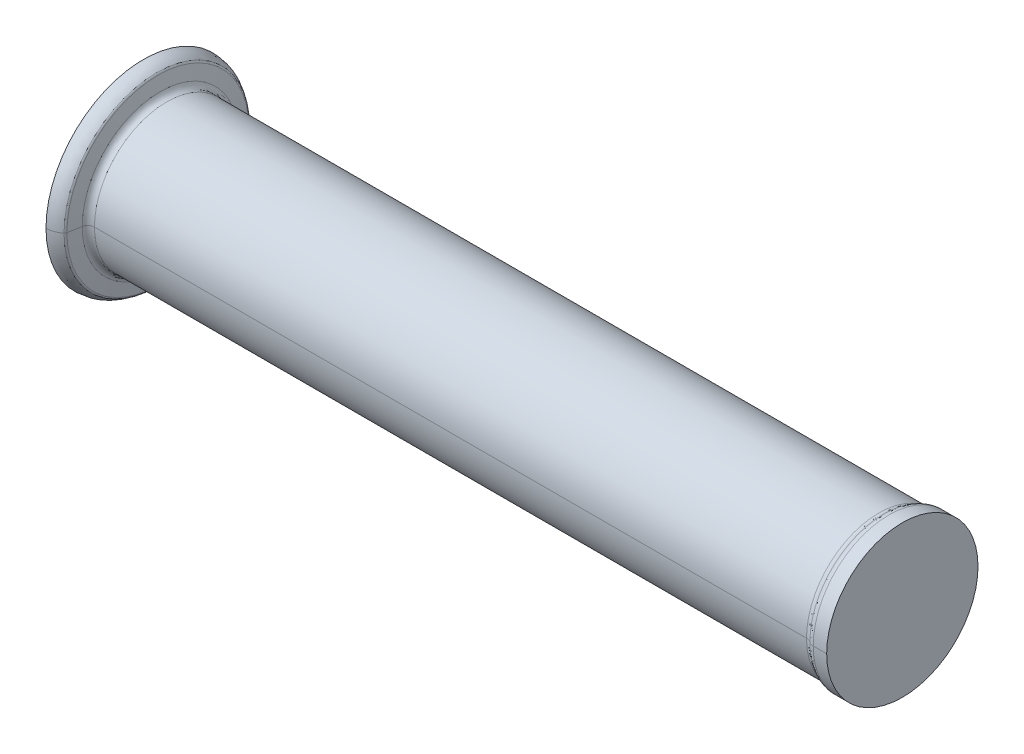
ISO-10303-21;
HEADER;
FILE_DESCRIPTION(('STEP AP214'),'2;1');
FILE_NAME('part.step','',(''),(''),'','','');
FILE_SCHEMA(('AUTOMOTIVE_DESIGN { 1 0 10303 214 1 1 1 1 }'));
ENDSEC;
DATA;
#1=APPLICATION_CONTEXT('core data for automotive mechanical design processes');
#2=APPLICATION_PROTOCOL_DEFINITION('international standard','automotive_design',2000,#1);
#3=PRODUCT_CONTEXT('',#1,'mechanical');
#4=PRODUCT('Part','Part','',(#3));
#5=PRODUCT_RELATED_PRODUCT_CATEGORY('part','',(#4));
#6=PRODUCT_DEFINITION_FORMATION('','',#4);
#7=PRODUCT_DEFINITION_CONTEXT('part definition',#1,'design');
#8=PRODUCT_DEFINITION('design','',#6,#7);
#9=PRODUCT_DEFINITION_SHAPE('','',#8);
#10=(LENGTH_UNIT() NAMED_UNIT(*) SI_UNIT(.MILLI.,.METRE.));
#11=(NAMED_UNIT(*) PLANE_ANGLE_UNIT() SI_UNIT($,.RADIAN.));
#12=(NAMED_UNIT(*) SI_UNIT($,.STERADIAN.) SOLID_ANGLE_UNIT());
#13=UNCERTAINTY_MEASURE_WITH_UNIT(LENGTH_MEASURE(1.E-05),#10,'distance_accuracy_value','');
#14=(GEOMETRIC_REPRESENTATION_CONTEXT(3) GLOBAL_UNCERTAINTY_ASSIGNED_CONTEXT((#13)) GLOBAL_UNIT_ASSIGNED_CONTEXT((#10,
#11,#12)) REPRESENTATION_CONTEXT('',''));
#15=CARTESIAN_POINT('',(0.,0.,0.));
#16=DIRECTION('',(0.,0.,1.));
#17=DIRECTION('',(1.,0.,0.));
#18=AXIS2_PLACEMENT_3D('',#15,#16,#17);
#19=CARTESIAN_POINT('',(-246.376197469678,22.236182274753,-4.27553941091218));
#20=DIRECTION('',(1.,0.,0.));
#21=DIRECTION('',(0.,0.,-1.));
#22=AXIS2_PLACEMENT_3D('',#19,#20,#21);
#23=CYLINDRICAL_SURFACE('',#22,43.);
#24=DIRECTION('',(1.,0.,0.));
#25=VECTOR('',#24,1.);
#26=CARTESIAN_POINT('',(-246.376197469678,22.236182274753,38.7244605890878));
#27=LINE('',#26,#25);
#28=CARTESIAN_POINT('',(-232.574031512422,22.236182274753,38.7244605890878));
#29=VERTEX_POINT('',#28);
#30=CARTESIAN_POINT('',(190.923802530321,22.236182274753,38.7244605890878));
#31=VERTEX_POINT('',#30);
#32=EDGE_CURVE('E114',#29,#31,#27,.T.);
#33=ORIENTED_EDGE('',*,*,#32,.F.);
#34=CARTESIAN_POINT('',(-232.574031512422,22.236182274753,-4.27553941091218));
#35=DIRECTION('',(1.,0.,0.));
#36=DIRECTION('',(0.,0.,-1.));
#37=AXIS2_PLACEMENT_3D('',#34,#35,#36);
#38=CIRCLE('',#37,43.);
#39=CARTESIAN_POINT('',(-232.574031512422,22.236182274753,-47.2755394109122));
#40=VERTEX_POINT('',#39);
#41=EDGE_CURVE('E21',#29,#40,#38,.T.);
#42=ORIENTED_EDGE('',*,*,#41,.T.);
#43=DIRECTION('',(1.,0.,0.));
#44=VECTOR('',#43,1.);
#45=CARTESIAN_POINT('',(-246.376197469678,22.236182274753,-47.2755394109122));
#46=LINE('',#45,#44);
#47=CARTESIAN_POINT('',(190.923802530321,22.236182274753,-47.2755394109122));
#48=VERTEX_POINT('',#47);
#49=EDGE_CURVE('E117',#40,#48,#46,.T.);
#50=ORIENTED_EDGE('',*,*,#49,.T.);
#51=CARTESIAN_POINT('',(190.923802530321,22.236182274753,-4.27553941091218));
#52=DIRECTION('',(-1.,0.,0.));
#53=DIRECTION('',(0.,0.,-1.));
#54=AXIS2_PLACEMENT_3D('',#51,#52,#53);
#55=CIRCLE('',#54,43.);
#56=EDGE_CURVE('E11',#48,#31,#55,.T.);
#57=ORIENTED_EDGE('',*,*,#56,.T.);
#58=EDGE_LOOP('',(#33,#42,#50,#57));
#59=FACE_BOUND('',#58,.T.);
#60=ADVANCED_FACE('F18',(#59),#23,.T.);
#61=CARTESIAN_POINT('',(190.923802530321,22.236182274753,38.7244605867936));
#62=CARTESIAN_POINT('',(190.923802530322,-63.7638177206586,38.7244605867936));
#63=CARTESIAN_POINT('',(190.923802530322,-63.7638177206587,-47.275539408618));
#64=CARTESIAN_POINT('',(190.923802530321,22.236182274753,-47.275539408618));
#65=CARTESIAN_POINT('',(192.015234199988,22.236182274753,38.7244605867937));
#66=CARTESIAN_POINT('',(192.015234199988,-63.7638177206587,38.7244605867936));
#67=CARTESIAN_POINT('',(192.015234199988,-63.7638177206587,-47.2755394086179));
#68=CARTESIAN_POINT('',(192.015234199988,22.236182274753,-47.2755394086181));
#69=CARTESIAN_POINT('',(193.050657195965,22.236182274753,39.0696015854524));
#70=CARTESIAN_POINT('',(193.050657195965,-64.454099717976,39.0696015854524));
#71=CARTESIAN_POINT('',(193.050657195965,-64.4540997179762,-47.6206804072767));
#72=CARTESIAN_POINT('',(193.050657195965,22.236182274753,-47.6206804072767));
#73=CARTESIAN_POINT('',(193.923802531698,22.236182274753,39.7244605872525));
#74=CARTESIAN_POINT('',(193.923802531698,-65.7638177215762,39.7244605872525));
#75=CARTESIAN_POINT('',(193.923802531698,-65.7638177215762,-48.2755394090767));
#76=CARTESIAN_POINT('',(193.923802531698,22.236182274753,-48.2755394090768));
#77=(BOUNDED_SURFACE() B_SPLINE_SURFACE(3,3,((#61,#62,#63,#64),(#65,#66,#67,#68),(#69,#70,#71,
#72),(#73,#74,#75,#76)),.UNSPECIFIED.,.F.,.F.,.F.) B_SPLINE_SURFACE_WITH_KNOTS((4,4),(4,4),(0.,
1.),(0.,1.),.UNSPECIFIED.) GEOMETRIC_REPRESENTATION_ITEM() RATIONAL_B_SPLINE_SURFACE(((1.,
0.333333333333334,0.333333333333334,1.),(0.96578886536701,0.321929621789003,0.321929621789003,
0.96578886536701),(0.96578886536701,0.321929621789003,0.321929621789003,0.96578886536701),(1.,
0.333333333333334,0.333333333333334,1.))) REPRESENTATION_ITEM('') SURFACE());
#78=CARTESIAN_POINT('',(190.923802530321,22.236182274753,43.7244605890878));
#79=DIRECTION('',(0.,-1.,0.));
#80=DIRECTION('',(0.,0.,1.));
#81=AXIS2_PLACEMENT_3D('',#78,#79,#80);
#82=CIRCLE('',#81,5.00000000229417);
#83=CARTESIAN_POINT('',(193.923802531698,22.236182274753,39.7244605872525));
#84=VERTEX_POINT('',#83);
#85=EDGE_CURVE('E134',#31,#84,#82,.T.);
#86=CARTESIAN_POINT('',(190.923802530321,22.236182274753,-52.2755394109122));
#87=DIRECTION('',(0.,1.,0.));
#88=DIRECTION('',(0.,0.,-1.));
#89=AXIS2_PLACEMENT_3D('',#86,#87,#88);
#90=CIRCLE('',#89,5.00000000229417);
#91=CARTESIAN_POINT('',(193.923802531698,22.236182274753,-48.2755394090768));
#92=VERTEX_POINT('',#91);
#93=EDGE_CURVE('E145',#48,#92,#90,.T.);
#94=CARTESIAN_POINT('',(193.923802531698,22.236182274753,-4.27553941091218));
#95=DIRECTION('',(1.,0.,0.));
#96=DIRECTION('',(0.,0.,-1.));
#97=AXIS2_PLACEMENT_3D('',#94,#95,#96);
#98=CIRCLE('',#97,43.9999999981647);
#99=EDGE_CURVE('E137',#84,#92,#98,.T.);
#100=ORIENTED_EDGE('',*,*,#85,.F.);
#101=ORIENTED_EDGE('',*,*,#56,.F.);
#102=ORIENTED_EDGE('',*,*,#93,.T.);
#103=ORIENTED_EDGE('',*,*,#99,.F.);
#104=EDGE_LOOP('',(#100,#101,#102,#103));
#105=FACE_BOUND('',#104,.T.);
#106=ADVANCED_FACE('F135',(#105),#77,.F.);
#107=CARTESIAN_POINT('',(-236.51326252447,22.236182274753,42.0298678784201));
#108=CARTESIAN_POINT('',(-236.513262524471,-70.3746323039115,42.02986787842));
#109=CARTESIAN_POINT('',(-236.513262524471,-70.3746323039116,-50.5809467002444));
#110=CARTESIAN_POINT('',(-236.51326252447,22.236182274753,-50.5809467002445));
#111=CARTESIAN_POINT('',(-236.160608563054,22.236182274753,40.0298678784201));
#112=CARTESIAN_POINT('',(-236.160608563054,-66.3746323039116,40.02986787842));
#113=CARTESIAN_POINT('',(-236.160608563054,-66.3746323039116,-48.5809467002444));
#114=CARTESIAN_POINT('',(-236.160608563054,22.236182274753,-48.5809467002444));
#115=CARTESIAN_POINT('',(-234.604884736193,22.236182274753,38.7244605890878));
#116=CARTESIAN_POINT('',(-234.604884736193,-63.763817725247,38.7244605890877));
#117=CARTESIAN_POINT('',(-234.604884736193,-63.763817725247,-47.2755394109122));
#118=CARTESIAN_POINT('',(-234.604884736193,22.236182274753,-47.2755394109122));
#119=CARTESIAN_POINT('',(-232.574031512422,22.236182274753,38.7244605890878));
#120=CARTESIAN_POINT('',(-232.574031512422,-63.7638177252469,38.7244605890878));
#121=CARTESIAN_POINT('',(-232.574031512422,-63.7638177252471,-47.2755394109122));
#122=CARTESIAN_POINT('',(-232.574031512422,22.236182274753,-47.2755394109122));
#123=(BOUNDED_SURFACE() B_SPLINE_SURFACE(3,3,((#107,#108,#109,#110),(#111,#112,#113,#114),(#115,
#116,#117,#118),(#119,#120,#121,#122)),.UNSPECIFIED.,.F.,.F.,
.F.) B_SPLINE_SURFACE_WITH_KNOTS((4,4),(4,4),(0.,1.),(0.,1.),
.UNSPECIFIED.) GEOMETRIC_REPRESENTATION_ITEM() RATIONAL_B_SPLINE_SURFACE(((1.,0.333333333333334,
0.333333333333334,1.),(0.844029628745984,0.281343209581995,0.281343209581995,0.844029628745984),
(0.844029628745984,0.281343209581995,0.281343209581995,0.844029628745984),(1.,0.333333333333334,
0.333333333333334,1.))) REPRESENTATION_ITEM('') SURFACE());
#124=CARTESIAN_POINT('',(-232.574031512422,22.236182274753,42.7244605890878));
#125=DIRECTION('',(0.,-1.,0.));
#126=DIRECTION('',(0.,0.,1.));
#127=AXIS2_PLACEMENT_3D('',#124,#125,#126);
#128=CIRCLE('',#127,4.);
#129=CARTESIAN_POINT('',(-236.51326252447,22.236182274753,42.0298678784201));
#130=VERTEX_POINT('',#129);
#131=EDGE_CURVE('E169',#130,#29,#128,.T.);
#132=CARTESIAN_POINT('',(-236.51326252447,22.236182274753,-4.27553941091218));
#133=DIRECTION('',(-1.,0.,0.));
#134=DIRECTION('',(0.,0.,-1.));
#135=AXIS2_PLACEMENT_3D('',#132,#133,#134);
#136=CIRCLE('',#135,46.3054072893323);
#137=CARTESIAN_POINT('',(-236.51326252447,22.236182274753,-50.5809467002445));
#138=VERTEX_POINT('',#137);
#139=EDGE_CURVE('E152',#138,#130,#136,.T.);
#140=CARTESIAN_POINT('',(-232.574031512422,22.236182274753,-51.2755394109122));
#141=DIRECTION('',(0.,1.,0.));
#142=DIRECTION('',(0.,0.,-1.));
#143=AXIS2_PLACEMENT_3D('',#140,#141,#142);
#144=CIRCLE('',#143,4.);
#145=EDGE_CURVE('E183',#138,#40,#144,.T.);
#146=ORIENTED_EDGE('',*,*,#131,.F.);
#147=ORIENTED_EDGE('',*,*,#139,.F.);
#148=ORIENTED_EDGE('',*,*,#145,.T.);
#149=ORIENTED_EDGE('',*,*,#41,.F.);
#150=EDGE_LOOP('',(#146,#147,#148,#149));
#151=FACE_BOUND('',#150,.T.);
#152=ADVANCED_FACE('F259',(#151),#123,.F.);
#153=CARTESIAN_POINT('',(196.923374122839,22.236182274753,-49.2755393810881));
#154=CARTESIAN_POINT('',(196.923374122839,112.236182215105,-49.2755393810881));
#155=CARTESIAN_POINT('',(196.923374122839,112.236182215105,40.7244605592636));
#156=CARTESIAN_POINT('',(196.923374122839,22.236182274753,40.7244605592637));
#157=CARTESIAN_POINT('',(195.832092938947,22.236182274753,-49.2754458784826));
#158=CARTESIAN_POINT('',(195.832092938947,112.235995209894,-49.2754458784825));
#159=CARTESIAN_POINT('',(195.832092938947,112.235995209894,40.7243670566582));
#160=CARTESIAN_POINT('',(195.832092938947,22.236182274753,40.7243670566582));
#161=CARTESIAN_POINT('',(194.796827487522,22.236182274753,-48.930308114474));
#162=CARTESIAN_POINT('',(194.796827487522,111.545719681877,-48.930308114474));
#163=CARTESIAN_POINT('',(194.796827487522,111.545719681877,40.3792292926497));
#164=CARTESIAN_POINT('',(194.796827487522,22.236182274753,40.3792292926497));
#165=CARTESIAN_POINT('',(193.923802537204,22.236182274753,-48.2755394017355));
#166=CARTESIAN_POINT('',(193.923802537204,110.2361822564,-48.2755394017354));
#167=CARTESIAN_POINT('',(193.923802537204,110.2361822564,39.7244605799111));
#168=CARTESIAN_POINT('',(193.923802537204,22.236182274753,39.7244605799111));
#169=(BOUNDED_SURFACE() B_SPLINE_SURFACE(3,3,((#153,#154,#155,#156),(#157,#158,#159,#160),(#161,
#162,#163,#164),(#165,#166,#167,#168)),.UNSPECIFIED.,.F.,.F.,
.F.) B_SPLINE_SURFACE_WITH_KNOTS((4,4),(4,4),(0.,1.),(0.,1.),
.UNSPECIFIED.) GEOMETRIC_REPRESENTATION_ITEM() RATIONAL_B_SPLINE_SURFACE(((1.,0.333333333333334,
0.333333333333334,1.),(0.965797896409398,0.321932632136466,0.321932632136466,0.965797896409398),
(0.965797896409398,0.321932632136466,0.321932632136466,0.965797896409398),(1.,0.333333333333334,
0.333333333333334,1.))) REPRESENTATION_ITEM('') SURFACE());
#170=CARTESIAN_POINT('',(196.923802530322,22.236182274753,35.7244605890878));
#171=DIRECTION('',(0.,-1.,0.));
#172=DIRECTION('',(0.,0.,1.));
#173=AXIS2_PLACEMENT_3D('',#170,#171,#172);
#174=CIRCLE('',#173,4.99999998852918);
#175=CARTESIAN_POINT('',(196.923374122839,22.236182274753,40.7244605592637));
#176=VERTEX_POINT('',#175);
#177=EDGE_CURVE('E191',#176,#84,#174,.T.);
#178=CARTESIAN_POINT('',(196.923374122839,22.236182274753,-4.27553941091218));
#179=DIRECTION('',(-1.,0.,0.));
#180=DIRECTION('',(0.,0.,-1.));
#181=AXIS2_PLACEMENT_3D('',#178,#179,#180);
#182=CIRCLE('',#181,44.9999999701759);
#183=CARTESIAN_POINT('',(196.923374122839,22.236182274753,-49.2755393810881));
#184=VERTEX_POINT('',#183);
#185=EDGE_CURVE('E192',#176,#184,#182,.T.);
#186=CARTESIAN_POINT('',(196.923802530322,22.236182274753,-44.2755394109122));
#187=DIRECTION('',(0.,1.,0.));
#188=DIRECTION('',(0.,0.,-1.));
#189=AXIS2_PLACEMENT_3D('',#186,#187,#188);
#190=CIRCLE('',#189,4.99999998852918);
#191=EDGE_CURVE('E178',#184,#92,#190,.T.);
#192=CARTESIAN_POINT('',(193.923802531698,22.236182274753,-4.27553941091218));
#193=DIRECTION('',(1.,0.,0.));
#194=DIRECTION('',(0.,0.,-1.));
#195=AXIS2_PLACEMENT_3D('',#192,#193,#194);
#196=CIRCLE('',#195,43.9999999981647);
#197=EDGE_CURVE('E142',#92,#84,#196,.T.);
#198=ORIENTED_EDGE('',*,*,#177,.F.);
#199=ORIENTED_EDGE('',*,*,#185,.T.);
#200=ORIENTED_EDGE('',*,*,#191,.T.);
#201=ORIENTED_EDGE('',*,*,#197,.T.);
#202=EDGE_LOOP('',(#198,#199,#200,#201));
#203=FACE_BOUND('',#202,.T.);
#204=ADVANCED_FACE('F308',(#203),#169,.T.);
#205=CARTESIAN_POINT('',(-237.882274368474,22.236182274753,-4.27553941091218));
#206=DIRECTION('',(-1.,0.,0.));
#207=DIRECTION('',(0.,0.,1.));
#208=AXIS2_PLACEMENT_3D('',#205,#206,#207);
#209=CONICAL_SURFACE('',#208,54.0694592710667,1.39626340159546);
#210=DIRECTION('',(-0.173648177666931,0.,-0.984807753012208));
#211=VECTOR('',#210,1.);
#212=CARTESIAN_POINT('',(-237.882274368474,22.236182274753,-58.3449986819789));
#213=LINE('',#212,#211);
#214=CARTESIAN_POINT('',(-237.882274368474,22.236182274753,-58.3449986819789));
#215=VERTEX_POINT('',#214);
#216=EDGE_CURVE('E219',#138,#215,#213,.T.);
#217=ORIENTED_EDGE('',*,*,#216,.F.);
#218=ORIENTED_EDGE('',*,*,#139,.T.);
#219=DIRECTION('',(-0.173648177666931,0.,0.984807753012208));
#220=VECTOR('',#219,1.);
#221=CARTESIAN_POINT('',(-237.882274368474,22.236182274753,49.7939198601545));
#222=LINE('',#221,#220);
#223=CARTESIAN_POINT('',(-237.882274368474,22.236182274753,49.7939198601545));
#224=VERTEX_POINT('',#223);
#225=EDGE_CURVE('E197',#130,#224,#222,.T.);
#226=ORIENTED_EDGE('',*,*,#225,.T.);
#227=CARTESIAN_POINT('',(-237.882274368474,22.236182274753,-4.27553941091218));
#228=DIRECTION('',(1.,0.,0.));
#229=DIRECTION('',(0.,0.,1.));
#230=AXIS2_PLACEMENT_3D('',#227,#228,#229);
#231=CIRCLE('',#230,54.0694592710667);
#232=EDGE_CURVE('E174',#224,#215,#231,.T.);
#233=ORIENTED_EDGE('',*,*,#232,.T.);
#234=EDGE_LOOP('',(#217,#218,#226,#233));
#235=FACE_BOUND('',#234,.T.);
#236=ADVANCED_FACE('F267',(#235),#209,.T.);
#237=CARTESIAN_POINT('',(204.923802530339,22.236182274753,-4.27553941091218));
#238=DIRECTION('',(1.,0.,0.));
#239=DIRECTION('',(0.,0.,-1.));
#240=AXIS2_PLACEMENT_3D('',#237,#238,#239);
#241=CONICAL_SURFACE('',#240,45.0006854519766,8.56814967809562E-05);
#242=DIRECTION('',(0.999999996329341,0.,8.56814967562567E-05));
#243=VECTOR('',#242,1.);
#244=CARTESIAN_POINT('',(204.923802530339,22.236182274753,40.7251460410644));
#245=LINE('',#244,#243);
#246=CARTESIAN_POINT('',(204.923802530336,22.236182274753,40.7251460410644));
#247=VERTEX_POINT('',#246);
#248=EDGE_CURVE('E196',#176,#247,#245,.T.);
#249=ORIENTED_EDGE('',*,*,#248,.F.);
#250=CARTESIAN_POINT('',(196.923374122839,22.236182274753,-4.27553941091218));
#251=DIRECTION('',(-1.,0.,0.));
#252=DIRECTION('',(0.,0.,-1.));
#253=AXIS2_PLACEMENT_3D('',#250,#251,#252);
#254=CIRCLE('',#253,44.9999999701759);
#255=EDGE_CURVE('E186',#184,#176,#254,.T.);
#256=ORIENTED_EDGE('',*,*,#255,.F.);
#257=DIRECTION('',(0.999999996329341,0.,-8.56814967562567E-05));
#258=VECTOR('',#257,1.);
#259=CARTESIAN_POINT('',(204.923802530339,22.236182274753,-49.2762248628888));
#260=LINE('',#259,#258);
#261=CARTESIAN_POINT('',(204.923802530336,22.236182274753,-49.2762248628888));
#262=VERTEX_POINT('',#261);
#263=EDGE_CURVE('E236',#184,#262,#260,.T.);
#264=ORIENTED_EDGE('',*,*,#263,.T.);
#265=CARTESIAN_POINT('',(204.923802530336,22.236182274753,-4.27553941091218));
#266=DIRECTION('',(-1.,0.,0.));
#267=DIRECTION('',(0.,0.,-1.));
#268=AXIS2_PLACEMENT_3D('',#265,#266,#267);
#269=CIRCLE('',#268,45.0006854519766);
#270=EDGE_CURVE('E39',#262,#247,#269,.T.);
#271=ORIENTED_EDGE('',*,*,#270,.T.);
#272=EDGE_LOOP('',(#249,#256,#264,#271));
#273=FACE_BOUND('',#272,.T.);
#274=ADVANCED_FACE('F330',(#273),#241,.T.);
#275=CARTESIAN_POINT('',(-237.882274368474,22.236182274753,-58.3449986819789));
#276=CARTESIAN_POINT('',(-237.882274368473,130.375100816886,-58.3449986819788));
#277=CARTESIAN_POINT('',(-237.882274368473,130.375100816886,49.7939198601546));
#278=CARTESIAN_POINT('',(-237.882274368474,22.236182274753,49.7939198601545));
#279=CARTESIAN_POINT('',(-237.956807356611,22.236182274753,-58.7676962625645));
#280=CARTESIAN_POINT('',(-237.956807356611,131.220495978057,-58.7676962625644));
#281=CARTESIAN_POINT('',(-237.956807356611,131.220495978057,50.2166174407401));
#282=CARTESIAN_POINT('',(-237.956807356611,22.236182274753,50.2166174407401));
#283=CARTESIAN_POINT('',(-238.17165107236,22.236182274753,-59.139274772111));
#284=CARTESIAN_POINT('',(-238.171651072359,131.963652997151,-59.139274772111));
#285=CARTESIAN_POINT('',(-238.171651072359,131.963652997151,50.5881959502865));
#286=CARTESIAN_POINT('',(-238.17165107236,22.236182274753,50.5881959502866));
#287=CARTESIAN_POINT('',(-238.500799371321,22.236182274753,-59.4147558209043));
#288=CARTESIAN_POINT('',(-238.500799371321,132.514615094737,-59.4147558209043));
#289=CARTESIAN_POINT('',(-238.500799371321,132.514615094737,50.8636769990799));
#290=CARTESIAN_POINT('',(-238.500799371321,22.236182274753,50.8636769990799));
#291=(BOUNDED_SURFACE() B_SPLINE_SURFACE(3,3,((#275,#276,#277,#278),(#279,#280,#281,#282),(#283,
#284,#285,#286),(#287,#288,#289,#290)),.UNSPECIFIED.,.F.,.F.,
.F.) B_SPLINE_SURFACE_WITH_KNOTS((4,4),(4,4),(0.,1.),(0.,1.),
.UNSPECIFIED.) GEOMETRIC_REPRESENTATION_ITEM() RATIONAL_B_SPLINE_SURFACE(((1.,0.333333333333334,
0.333333333333334,1.),(0.95965106650077,0.31988368883359,0.31988368883359,0.95965106650077),
(0.95965106650077,0.31988368883359,0.31988368883359,0.95965106650077),(1.,0.333333333333334,
0.333333333333334,1.))) REPRESENTATION_ITEM('') SURFACE());
#292=CARTESIAN_POINT('',(-239.658223163439,22.236182274753,49.4807721712455));
#293=DIRECTION('',(0.,-1.,0.));
#294=DIRECTION('',(0.,0.,1.));
#295=AXIS2_PLACEMENT_3D('',#292,#293,#294);
#296=CIRCLE('',#295,1.80334566775389);
#297=CARTESIAN_POINT('',(-238.500799371321,22.236182274753,50.8636769990799));
#298=VERTEX_POINT('',#297);
#299=EDGE_CURVE('E173',#224,#298,#296,.T.);
#300=CARTESIAN_POINT('',(-237.882274368474,22.236182274753,-4.27553941091218));
#301=DIRECTION('',(1.,0.,0.));
#302=DIRECTION('',(0.,0.,1.));
#303=AXIS2_PLACEMENT_3D('',#300,#301,#302);
#304=CIRCLE('',#303,54.0694592710667);
#305=EDGE_CURVE('E223',#215,#224,#304,.T.);
#306=CARTESIAN_POINT('',(-239.658223163439,22.236182274753,-58.0318509930699));
#307=DIRECTION('',(0.,1.,0.));
#308=DIRECTION('',(0.,0.,-1.));
#309=AXIS2_PLACEMENT_3D('',#306,#307,#308);
#310=CIRCLE('',#309,1.80334566775389);
#311=CARTESIAN_POINT('',(-238.500799371321,22.236182274753,-59.4147558209043));
#312=VERTEX_POINT('',#311);
#313=EDGE_CURVE('E160',#215,#312,#310,.T.);
#314=CARTESIAN_POINT('',(-238.500799371321,22.236182274753,-4.27553941091218));
#315=DIRECTION('',(1.,0.,0.));
#316=DIRECTION('',(0.,0.,-1.));
#317=AXIS2_PLACEMENT_3D('',#314,#315,#316);
#318=CIRCLE('',#317,55.1392164099921);
#319=EDGE_CURVE('E242',#312,#298,#318,.T.);
#320=ORIENTED_EDGE('',*,*,#299,.F.);
#321=ORIENTED_EDGE('',*,*,#305,.F.);
#322=ORIENTED_EDGE('',*,*,#313,.T.);
#323=ORIENTED_EDGE('',*,*,#319,.T.);
#324=EDGE_LOOP('',(#320,#321,#322,#323));
#325=FACE_BOUND('',#324,.T.);
#326=ADVANCED_FACE('F273',(#325),#291,.T.);
#327=CARTESIAN_POINT('',(204.923802530322,22.236182274753,-49.2762248628888));
#328=DIRECTION('',(1.,0.,0.));
#329=DIRECTION('',(0.,1.,0.));
#330=AXIS2_PLACEMENT_3D('',#327,#328,#329);
#331=PLANE('',#330);
#332=ORIENTED_EDGE('',*,*,#270,.F.);
#333=CARTESIAN_POINT('',(204.923802530336,22.236182274753,-4.27553941091218));
#334=DIRECTION('',(-1.,0.,0.));
#335=DIRECTION('',(0.,0.,-1.));
#336=AXIS2_PLACEMENT_3D('',#333,#334,#335);
#337=CIRCLE('',#336,45.0006854519766);
#338=EDGE_CURVE('E232',#247,#262,#337,.T.);
#339=ORIENTED_EDGE('',*,*,#338,.F.);
#340=EDGE_LOOP('',(#332,#339));
#341=FACE_BOUND('',#340,.T.);
#342=ADVANCED_FACE('F296',(#341),#331,.T.);
#343=CARTESIAN_POINT('',(-238.500799371321,22.236182274753,-59.4147558209043));
#344=CARTESIAN_POINT('',(-238.500799371321,132.514615094737,-59.4147558209043));
#345=CARTESIAN_POINT('',(-238.500799371321,132.514615094737,50.8636769990799));
#346=CARTESIAN_POINT('',(-238.500799371321,22.236182274753,50.8636769990799));
#347=CARTESIAN_POINT('',(-240.731984145582,22.236182274753,-61.2821484934594));
#348=CARTESIAN_POINT('',(-240.731984145582,136.249400439847,-61.2821484934595));
#349=CARTESIAN_POINT('',(-240.731984145582,136.249400439847,52.731069671635));
#350=CARTESIAN_POINT('',(-240.731984145582,22.236182274753,52.731069671635));
#351=CARTESIAN_POINT('',(-243.466671582114,22.236182274753,-62.2755394109123));
#352=CARTESIAN_POINT('',(-243.466671582114,138.236182274753,-62.2755394109122));
#353=CARTESIAN_POINT('',(-243.466671582114,138.236182274753,53.7244605890879));
#354=CARTESIAN_POINT('',(-243.466671582114,22.236182274753,53.7244605890878));
#355=CARTESIAN_POINT('',(-246.376197469678,22.236182274753,-62.2755394109122));
#356=CARTESIAN_POINT('',(-246.376197469678,138.236182274753,-62.2755394109122));
#357=CARTESIAN_POINT('',(-246.376197469678,138.236182274753,53.7244605890878));
#358=CARTESIAN_POINT('',(-246.376197469678,22.236182274753,53.7244605890878));
#359=(BOUNDED_SURFACE() B_SPLINE_SURFACE(3,3,((#343,#344,#345,#346),(#347,#348,#349,#350),(#351,
#352,#353,#354),(#355,#356,#357,#358)),.UNSPECIFIED.,.F.,.F.,
.F.) B_SPLINE_SURFACE_WITH_KNOTS((4,4),(4,4),(0.,1.),(0.,1.),
.UNSPECIFIED.) GEOMETRIC_REPRESENTATION_ITEM() RATIONAL_B_SPLINE_SURFACE(((1.,0.333333333333334,
0.333333333333334,1.),(0.959938845070026,0.319979615023342,0.319979615023342,0.959938845070026),
(0.959938845070026,0.319979615023342,0.319979615023342,0.959938845070026),(1.,0.333333333333334,
0.333333333333334,1.))) REPRESENTATION_ITEM('') SURFACE());
#360=CARTESIAN_POINT('',(-246.376197469678,22.236182274753,41.4540500970671));
#361=DIRECTION('',(0.,-1.,0.));
#362=DIRECTION('',(0.,0.,1.));
#363=AXIS2_PLACEMENT_3D('',#360,#361,#362);
#364=CIRCLE('',#363,12.2704104920207);
#365=CARTESIAN_POINT('',(-246.376197469678,22.236182274753,53.7244605890878));
#366=VERTEX_POINT('',#365);
#367=EDGE_CURVE('E164',#298,#366,#364,.T.);
#368=CARTESIAN_POINT('',(-246.376197469678,22.236182274753,-50.0051289188914));
#369=DIRECTION('',(0.,1.,0.));
#370=DIRECTION('',(0.,0.,-1.));
#371=AXIS2_PLACEMENT_3D('',#368,#369,#370);
#372=CIRCLE('',#371,12.2704104920207);
#373=CARTESIAN_POINT('',(-246.376197469678,22.236182274753,-62.2755394109122));
#374=VERTEX_POINT('',#373);
#375=EDGE_CURVE('E131',#312,#374,#372,.T.);
#376=CARTESIAN_POINT('',(-246.376197469678,22.236182274753,-4.27553941091218));
#377=DIRECTION('',(1.,0.,0.));
#378=DIRECTION('',(0.,0.,-1.));
#379=AXIS2_PLACEMENT_3D('',#376,#377,#378);
#380=CIRCLE('',#379,58.);
#381=EDGE_CURVE('E239',#374,#366,#380,.T.);
#382=ORIENTED_EDGE('',*,*,#367,.F.);
#383=ORIENTED_EDGE('',*,*,#319,.F.);
#384=ORIENTED_EDGE('',*,*,#375,.T.);
#385=ORIENTED_EDGE('',*,*,#381,.T.);
#386=EDGE_LOOP('',(#382,#383,#384,#385));
#387=FACE_BOUND('',#386,.T.);
#388=ADVANCED_FACE('F277',(#387),#359,.T.);
#389=CARTESIAN_POINT('',(-246.376197469678,22.236182274753,-62.2755394109122));
#390=DIRECTION('',(-1.,0.,0.));
#391=DIRECTION('',(0.,0.,1.));
#392=AXIS2_PLACEMENT_3D('',#389,#390,#391);
#393=PLANE('',#392);
#394=ORIENTED_EDGE('',*,*,#381,.F.);
#395=CARTESIAN_POINT('',(-246.376197469678,22.236182274753,-4.27553941091218));
#396=DIRECTION('',(1.,0.,0.));
#397=DIRECTION('',(0.,0.,-1.));
#398=AXIS2_PLACEMENT_3D('',#395,#396,#397);
#399=CIRCLE('',#398,58.);
#400=EDGE_CURVE('E210',#366,#374,#399,.T.);
#401=ORIENTED_EDGE('',*,*,#400,.F.);
#402=EDGE_LOOP('',(#394,#401));
#403=FACE_BOUND('',#402,.T.);
#404=ADVANCED_FACE('F282',(#403),#393,.T.);
#405=CARTESIAN_POINT('',(204.923802530339,22.236182274753,-4.27553941091218));
#406=DIRECTION('',(1.,0.,0.));
#407=DIRECTION('',(0.,0.,-1.));
#408=AXIS2_PLACEMENT_3D('',#405,#406,#407);
#409=CONICAL_SURFACE('',#408,45.0006854519766,8.56814967809562E-05);
#410=ORIENTED_EDGE('',*,*,#185,.F.);
#411=ORIENTED_EDGE('',*,*,#248,.T.);
#412=ORIENTED_EDGE('',*,*,#338,.T.);
#413=ORIENTED_EDGE('',*,*,#263,.F.);
#414=EDGE_LOOP('',(#410,#411,#412,#413));
#415=FACE_BOUND('',#414,.T.);
#416=ADVANCED_FACE('F284',(#415),#409,.T.);
#417=CARTESIAN_POINT('',(-237.882274368474,22.236182274753,-4.27553941091218));
#418=DIRECTION('',(-1.,0.,0.));
#419=DIRECTION('',(0.,0.,1.));
#420=AXIS2_PLACEMENT_3D('',#417,#418,#419);
#421=CONICAL_SURFACE('',#420,54.0694592710667,1.39626340159546);
#422=CARTESIAN_POINT('',(-236.51326252447,22.236182274753,-4.27553941091218));
#423=DIRECTION('',(-1.,0.,0.));
#424=DIRECTION('',(0.,0.,-1.));
#425=AXIS2_PLACEMENT_3D('',#422,#423,#424);
#426=CIRCLE('',#425,46.3054072893323);
#427=EDGE_CURVE('E159',#130,#138,#426,.T.);
#428=ORIENTED_EDGE('',*,*,#427,.T.);
#429=ORIENTED_EDGE('',*,*,#216,.T.);
#430=ORIENTED_EDGE('',*,*,#305,.T.);
#431=ORIENTED_EDGE('',*,*,#225,.F.);
#432=EDGE_LOOP('',(#428,#429,#430,#431));
#433=FACE_BOUND('',#432,.T.);
#434=ADVANCED_FACE('F264',(#433),#421,.T.);
#435=CARTESIAN_POINT('',(-246.376197469678,22.236182274753,-4.27553941091218));
#436=DIRECTION('',(1.,0.,0.));
#437=DIRECTION('',(0.,0.,-1.));
#438=AXIS2_PLACEMENT_3D('',#435,#436,#437);
#439=CYLINDRICAL_SURFACE('',#438,43.);
#440=CARTESIAN_POINT('',(-232.574031512422,22.236182274753,-4.27553941091218));
#441=DIRECTION('',(1.,0.,0.));
#442=DIRECTION('',(0.,0.,-1.));
#443=AXIS2_PLACEMENT_3D('',#440,#441,#442);
#444=CIRCLE('',#443,43.);
#445=EDGE_CURVE('E128',#40,#29,#444,.T.);
#446=ORIENTED_EDGE('',*,*,#445,.T.);
#447=ORIENTED_EDGE('',*,*,#32,.T.);
#448=CARTESIAN_POINT('',(190.923802530321,22.236182274753,-4.27553941091218));
#449=DIRECTION('',(-1.,0.,0.));
#450=DIRECTION('',(0.,0.,-1.));
#451=AXIS2_PLACEMENT_3D('',#448,#449,#450);
#452=CIRCLE('',#451,43.);
#453=EDGE_CURVE('E126',#31,#48,#452,.T.);
#454=ORIENTED_EDGE('',*,*,#453,.T.);
#455=ORIENTED_EDGE('',*,*,#49,.F.);
#456=EDGE_LOOP('',(#446,#447,#454,#455));
#457=FACE_BOUND('',#456,.T.);
#458=ADVANCED_FACE('F124',(#457),#439,.T.);
#459=CARTESIAN_POINT('',(-238.500799371321,22.236182274753,50.8636769990799));
#460=CARTESIAN_POINT('',(-238.500799371321,-88.0422505452312,50.8636769990799));
#461=CARTESIAN_POINT('',(-238.500799371321,-88.0422505452312,-59.4147558209043));
#462=CARTESIAN_POINT('',(-238.500799371321,22.236182274753,-59.4147558209043));
#463=CARTESIAN_POINT('',(-240.731984145582,22.236182274753,52.731069671635));
#464=CARTESIAN_POINT('',(-240.731984145582,-91.7770358903415,52.731069671635));
#465=CARTESIAN_POINT('',(-240.731984145582,-91.7770358903415,-61.2821484934594));
#466=CARTESIAN_POINT('',(-240.731984145582,22.236182274753,-61.2821484934594));
#467=CARTESIAN_POINT('',(-243.466671582114,22.236182274753,53.7244605890878));
#468=CARTESIAN_POINT('',(-243.466671582114,-93.763817725247,53.7244605890879));
#469=CARTESIAN_POINT('',(-243.466671582114,-93.763817725247,-62.2755394109122));
#470=CARTESIAN_POINT('',(-243.466671582114,22.236182274753,-62.2755394109122));
#471=CARTESIAN_POINT('',(-246.376197469678,22.236182274753,53.7244605890878));
#472=CARTESIAN_POINT('',(-246.376197469678,-93.7638177252469,53.7244605890878));
#473=CARTESIAN_POINT('',(-246.376197469678,-93.763817725247,-62.2755394109122));
#474=CARTESIAN_POINT('',(-246.376197469678,22.236182274753,-62.2755394109122));
#475=(BOUNDED_SURFACE() B_SPLINE_SURFACE(3,3,((#459,#460,#461,#462),(#463,#464,#465,#466),(#467,
#468,#469,#470),(#471,#472,#473,#474)),.UNSPECIFIED.,.F.,.F.,
.F.) B_SPLINE_SURFACE_WITH_KNOTS((4,4),(4,4),(0.,1.),(0.,1.),
.UNSPECIFIED.) GEOMETRIC_REPRESENTATION_ITEM() RATIONAL_B_SPLINE_SURFACE(((1.,0.333333333333334,
0.333333333333334,1.),(0.959938845070026,0.319979615023342,0.319979615023342,0.959938845070026),
(0.959938845070026,0.319979615023342,0.319979615023342,0.959938845070026),(1.,0.333333333333334,
0.333333333333334,1.))) REPRESENTATION_ITEM('') SURFACE());
#476=CARTESIAN_POINT('',(-238.500799371321,22.236182274753,-4.27553941091218));
#477=DIRECTION('',(1.,0.,0.));
#478=DIRECTION('',(0.,0.,-1.));
#479=AXIS2_PLACEMENT_3D('',#476,#477,#478);
#480=CIRCLE('',#479,55.1392164099921);
#481=EDGE_CURVE('E165',#298,#312,#480,.T.);
#482=ORIENTED_EDGE('',*,*,#481,.F.);
#483=ORIENTED_EDGE('',*,*,#367,.T.);
#484=ORIENTED_EDGE('',*,*,#400,.T.);
#485=ORIENTED_EDGE('',*,*,#375,.F.);
#486=EDGE_LOOP('',(#482,#483,#484,#485));
#487=FACE_BOUND('',#486,.T.);
#488=ADVANCED_FACE('F280',(#487),#475,.T.);
#489=CARTESIAN_POINT('',(-237.882274368474,22.236182274753,49.7939198601545));
#490=CARTESIAN_POINT('',(-237.882274368473,-85.9027362673804,49.7939198601546));
#491=CARTESIAN_POINT('',(-237.882274368473,-85.9027362673804,-58.3449986819788));
#492=CARTESIAN_POINT('',(-237.882274368474,22.236182274753,-58.3449986819789));
#493=CARTESIAN_POINT('',(-237.956807356611,22.236182274753,50.21661744074));
#494=CARTESIAN_POINT('',(-237.956807356611,-86.7481314285514,50.2166174407401));
#495=CARTESIAN_POINT('',(-237.956807356611,-86.7481314285514,-58.7676962625644));
#496=CARTESIAN_POINT('',(-237.956807356611,22.236182274753,-58.7676962625644));
#497=CARTESIAN_POINT('',(-238.17165107236,22.236182274753,50.5881959502867));
#498=CARTESIAN_POINT('',(-238.171651072359,-87.4912884476446,50.5881959502867));
#499=CARTESIAN_POINT('',(-238.171651072359,-87.4912884476446,-59.139274772111));
#500=CARTESIAN_POINT('',(-238.17165107236,22.236182274753,-59.139274772111));
#501=CARTESIAN_POINT('',(-238.500799371321,22.236182274753,50.8636769990799));
#502=CARTESIAN_POINT('',(-238.500799371321,-88.0422505452312,50.8636769990799));
#503=CARTESIAN_POINT('',(-238.500799371321,-88.0422505452312,-59.4147558209043));
#504=CARTESIAN_POINT('',(-238.500799371321,22.236182274753,-59.4147558209043));
#505=(BOUNDED_SURFACE() B_SPLINE_SURFACE(3,3,((#489,#490,#491,#492),(#493,#494,#495,#496),(#497,
#498,#499,#500),(#501,#502,#503,#504)),.UNSPECIFIED.,.F.,.F.,
.F.) B_SPLINE_SURFACE_WITH_KNOTS((4,4),(4,4),(0.,1.),(0.,1.),
.UNSPECIFIED.) GEOMETRIC_REPRESENTATION_ITEM() RATIONAL_B_SPLINE_SURFACE(((1.,0.333333333333334,
0.333333333333334,1.),(0.959651066500771,0.31988368883359,0.31988368883359,0.959651066500771),
(0.959651066500771,0.31988368883359,0.31988368883359,0.959651066500771),(1.,0.333333333333334,
0.333333333333334,1.))) REPRESENTATION_ITEM('') SURFACE());
#506=ORIENTED_EDGE('',*,*,#232,.F.);
#507=ORIENTED_EDGE('',*,*,#299,.T.);
#508=ORIENTED_EDGE('',*,*,#481,.T.);
#509=ORIENTED_EDGE('',*,*,#313,.F.);
#510=EDGE_LOOP('',(#506,#507,#508,#509));
#511=FACE_BOUND('',#510,.T.);
#512=ADVANCED_FACE('F270',(#511),#505,.T.);
#513=CARTESIAN_POINT('',(196.923374122839,22.236182274753,40.7244605592637));
#514=CARTESIAN_POINT('',(196.923374122839,-67.7638176655987,40.7244605592637));
#515=CARTESIAN_POINT('',(196.923374122839,-67.7638176655987,-49.275539381088));
#516=CARTESIAN_POINT('',(196.923374122839,22.236182274753,-49.2755393810881));
#517=CARTESIAN_POINT('',(195.832092938947,22.236182274753,40.7243670566582));
#518=CARTESIAN_POINT('',(195.832092938947,-67.7636306603877,40.7243670566582));
#519=CARTESIAN_POINT('',(195.832092938947,-67.7636306603877,-49.2754458784825));
#520=CARTESIAN_POINT('',(195.832092938947,22.236182274753,-49.2754458784826));
#521=CARTESIAN_POINT('',(194.796827487522,22.236182274753,40.3792292926497));
#522=CARTESIAN_POINT('',(194.796827487522,-67.0733551323707,40.3792292926497));
#523=CARTESIAN_POINT('',(194.796827487522,-67.0733551323707,-48.930308114474));
#524=CARTESIAN_POINT('',(194.796827487522,22.236182274753,-48.930308114474));
#525=CARTESIAN_POINT('',(193.923802537204,22.236182274753,39.7244605799111));
#526=CARTESIAN_POINT('',(193.923802537204,-65.7638177068936,39.7244605799111));
#527=CARTESIAN_POINT('',(193.923802537204,-65.7638177068936,-48.2755394017354));
#528=CARTESIAN_POINT('',(193.923802537204,22.236182274753,-48.2755394017355));
#529=(BOUNDED_SURFACE() B_SPLINE_SURFACE(3,3,((#513,#514,#515,#516),(#517,#518,#519,#520),(#521,
#522,#523,#524),(#525,#526,#527,#528)),.UNSPECIFIED.,.F.,.F.,
.F.) B_SPLINE_SURFACE_WITH_KNOTS((4,4),(4,4),(0.,1.),(0.,1.),
.UNSPECIFIED.) GEOMETRIC_REPRESENTATION_ITEM() RATIONAL_B_SPLINE_SURFACE(((1.,0.333333333333334,
0.333333333333334,1.),(0.965797896409398,0.321932632136466,0.321932632136466,0.965797896409398),
(0.965797896409398,0.321932632136466,0.321932632136466,0.965797896409398),(1.,0.333333333333334,
0.333333333333334,1.))) REPRESENTATION_ITEM('') SURFACE());
#530=ORIENTED_EDGE('',*,*,#255,.T.);
#531=ORIENTED_EDGE('',*,*,#177,.T.);
#532=ORIENTED_EDGE('',*,*,#99,.T.);
#533=ORIENTED_EDGE('',*,*,#191,.F.);
#534=EDGE_LOOP('',(#530,#531,#532,#533));
#535=FACE_BOUND('',#534,.T.);
#536=ADVANCED_FACE('F388',(#535),#529,.T.);
#537=CARTESIAN_POINT('',(-236.51326252447,22.236182274753,-50.5809467002445));
#538=CARTESIAN_POINT('',(-236.513262524471,114.846996853417,-50.5809467002444));
#539=CARTESIAN_POINT('',(-236.513262524471,114.846996853417,42.02986787842));
#540=CARTESIAN_POINT('',(-236.51326252447,22.236182274753,42.0298678784201));
#541=CARTESIAN_POINT('',(-236.160608563054,22.236182274753,-48.5809467002444));
#542=CARTESIAN_POINT('',(-236.160608563053,110.846996853417,-48.5809467002444));
#543=CARTESIAN_POINT('',(-236.160608563053,110.846996853417,40.02986787842));
#544=CARTESIAN_POINT('',(-236.160608563054,22.236182274753,40.0298678784201));
#545=CARTESIAN_POINT('',(-234.604884736193,22.236182274753,-47.2755394109122));
#546=CARTESIAN_POINT('',(-234.604884736193,108.236182274753,-47.2755394109122));
#547=CARTESIAN_POINT('',(-234.604884736193,108.236182274753,38.7244605890877));
#548=CARTESIAN_POINT('',(-234.604884736193,22.236182274753,38.7244605890878));
#549=CARTESIAN_POINT('',(-232.574031512422,22.236182274753,-47.2755394109122));
#550=CARTESIAN_POINT('',(-232.574031512422,108.236182274753,-47.2755394109122));
#551=CARTESIAN_POINT('',(-232.574031512422,108.236182274753,38.7244605890878));
#552=CARTESIAN_POINT('',(-232.574031512422,22.236182274753,38.7244605890878));
#553=(BOUNDED_SURFACE() B_SPLINE_SURFACE(3,3,((#537,#538,#539,#540),(#541,#542,#543,#544),(#545,
#546,#547,#548),(#549,#550,#551,#552)),.UNSPECIFIED.,.F.,.F.,
.F.) B_SPLINE_SURFACE_WITH_KNOTS((4,4),(4,4),(0.,1.),(0.,1.),
.UNSPECIFIED.) GEOMETRIC_REPRESENTATION_ITEM() RATIONAL_B_SPLINE_SURFACE(((1.,0.333333333333334,
0.333333333333334,1.),(0.844029628745984,0.281343209581995,0.281343209581995,0.844029628745984),
(0.844029628745984,0.281343209581995,0.281343209581995,0.844029628745984),(1.,0.333333333333334,
0.333333333333334,1.))) REPRESENTATION_ITEM('') SURFACE());
#554=ORIENTED_EDGE('',*,*,#427,.F.);
#555=ORIENTED_EDGE('',*,*,#131,.T.);
#556=ORIENTED_EDGE('',*,*,#445,.F.);
#557=ORIENTED_EDGE('',*,*,#145,.F.);
#558=EDGE_LOOP('',(#554,#555,#556,#557));
#559=FACE_BOUND('',#558,.T.);
#560=ADVANCED_FACE('F262',(#559),#553,.F.);
#561=CARTESIAN_POINT('',(190.923802530321,22.236182274753,-47.275539408618));
#562=CARTESIAN_POINT('',(190.923802530322,108.236182270165,-47.275539408618));
#563=CARTESIAN_POINT('',(190.923802530322,108.236182270165,38.7244605867936));
#564=CARTESIAN_POINT('',(190.923802530321,22.236182274753,38.7244605867936));
#565=CARTESIAN_POINT('',(192.015234199988,22.236182274753,-47.2755394086181));
#566=CARTESIAN_POINT('',(192.015234199989,108.236182270165,-47.2755394086181));
#567=CARTESIAN_POINT('',(192.015234199989,108.236182270165,38.7244605867936));
#568=CARTESIAN_POINT('',(192.015234199988,22.236182274753,38.7244605867937));
#569=CARTESIAN_POINT('',(193.050657195965,22.236182274753,-47.6206804072767));
#570=CARTESIAN_POINT('',(193.050657195965,108.926464267482,-47.6206804072767));
#571=CARTESIAN_POINT('',(193.050657195965,108.926464267482,39.0696015854524));
#572=CARTESIAN_POINT('',(193.050657195965,22.236182274753,39.0696015854524));
#573=CARTESIAN_POINT('',(193.923802531698,22.236182274753,-48.2755394090768));
#574=CARTESIAN_POINT('',(193.923802531698,110.236182271082,-48.2755394090769));
#575=CARTESIAN_POINT('',(193.923802531698,110.236182271082,39.7244605872524));
#576=CARTESIAN_POINT('',(193.923802531698,22.236182274753,39.7244605872525));
#577=(BOUNDED_SURFACE() B_SPLINE_SURFACE(3,3,((#561,#562,#563,#564),(#565,#566,#567,#568),(#569,
#570,#571,#572),(#573,#574,#575,#576)),.UNSPECIFIED.,.F.,.F.,
.F.) B_SPLINE_SURFACE_WITH_KNOTS((4,4),(4,4),(0.,1.),(0.,1.),
.UNSPECIFIED.) GEOMETRIC_REPRESENTATION_ITEM() RATIONAL_B_SPLINE_SURFACE(((1.,0.333333333333334,
0.333333333333334,1.),(0.96578886536701,0.321929621789003,0.321929621789003,0.96578886536701),
(0.96578886536701,0.321929621789003,0.321929621789003,0.96578886536701),(1.,0.333333333333334,
0.333333333333334,1.))) REPRESENTATION_ITEM('') SURFACE());
#578=ORIENTED_EDGE('',*,*,#453,.F.);
#579=ORIENTED_EDGE('',*,*,#85,.T.);
#580=ORIENTED_EDGE('',*,*,#197,.F.);
#581=ORIENTED_EDGE('',*,*,#93,.F.);
#582=EDGE_LOOP('',(#578,#579,#580,#581));
#583=FACE_BOUND('',#582,.T.);
#584=ADVANCED_FACE('F144',(#583),#577,.F.);
#585=CLOSED_SHELL('',(#60,#106,#152,#204,#236,#274,#326,#342,#388,#404,#416,#434,#458,#488,#512,
#536,#560,#584));
#586=MANIFOLD_SOLID_BREP('B1',#585);
#587=ADVANCED_BREP_SHAPE_REPRESENTATION('',(#18,#586),#14);
#588=SHAPE_DEFINITION_REPRESENTATION(#9,#587);
ENDSEC;
END-ISO-10303-21;
